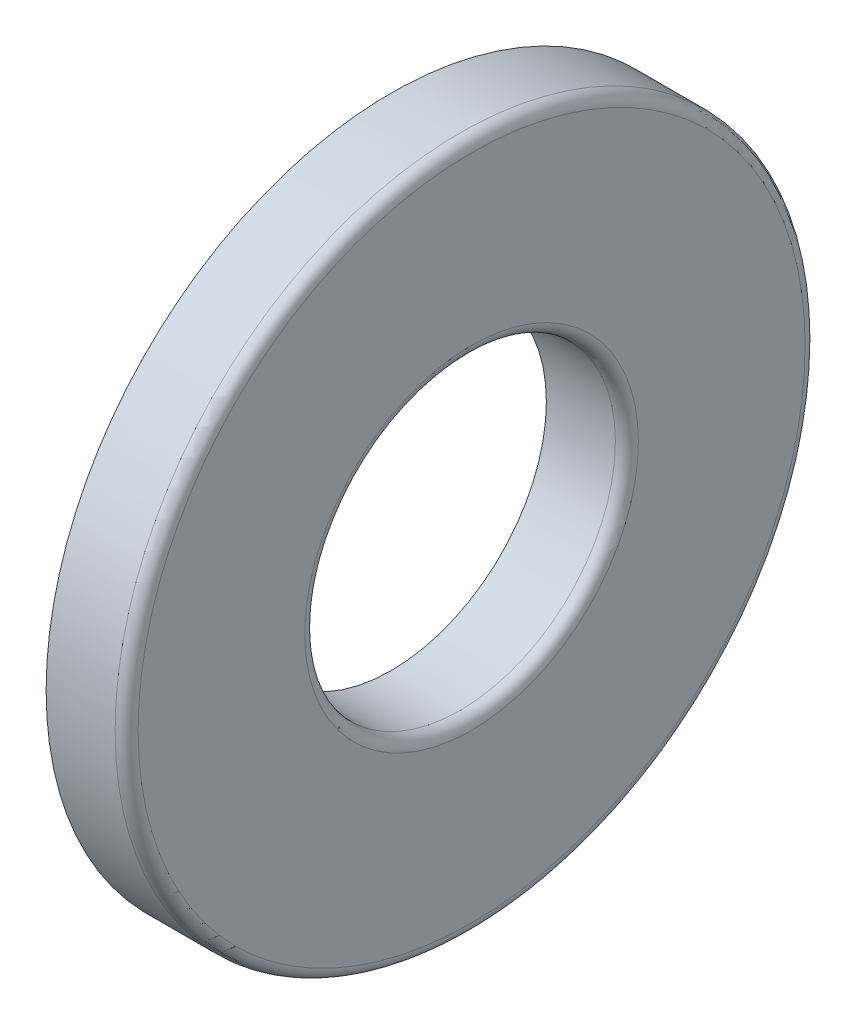
ISO-10303-21;
HEADER;
FILE_DESCRIPTION(('STEP AP214'),'2;1');
FILE_NAME('part.step','',(''),(''),'','','');
FILE_SCHEMA(('AUTOMOTIVE_DESIGN { 1 0 10303 214 1 1 1 1 }'));
ENDSEC;
DATA;
#1=APPLICATION_CONTEXT('core data for automotive mechanical design processes');
#2=APPLICATION_PROTOCOL_DEFINITION('international standard','automotive_design',2000,#1);
#3=PRODUCT_CONTEXT('',#1,'mechanical');
#4=PRODUCT('Part','Part','',(#3));
#5=PRODUCT_RELATED_PRODUCT_CATEGORY('part','',(#4));
#6=PRODUCT_DEFINITION_FORMATION('','',#4);
#7=PRODUCT_DEFINITION_CONTEXT('part definition',#1,'design');
#8=PRODUCT_DEFINITION('design','',#6,#7);
#9=PRODUCT_DEFINITION_SHAPE('','',#8);
#10=(LENGTH_UNIT() NAMED_UNIT(*) SI_UNIT(.MILLI.,.METRE.));
#11=(NAMED_UNIT(*) PLANE_ANGLE_UNIT() SI_UNIT($,.RADIAN.));
#12=(NAMED_UNIT(*) SI_UNIT($,.STERADIAN.) SOLID_ANGLE_UNIT());
#13=UNCERTAINTY_MEASURE_WITH_UNIT(LENGTH_MEASURE(1.E-05),#10,'distance_accuracy_value','');
#14=(GEOMETRIC_REPRESENTATION_CONTEXT(3) GLOBAL_UNCERTAINTY_ASSIGNED_CONTEXT((#13)) GLOBAL_UNIT_ASSIGNED_CONTEXT((#10,
#11,#12)) REPRESENTATION_CONTEXT('',''));
#15=CARTESIAN_POINT('',(0.,0.,0.));
#16=DIRECTION('',(0.,0.,1.));
#17=DIRECTION('',(1.,0.,0.));
#18=AXIS2_PLACEMENT_3D('',#15,#16,#17);
#19=CARTESIAN_POINT('',(12.,0.,0.));
#20=DIRECTION('',(1.,0.,0.));
#21=DIRECTION('',(0.,0.,-1.));
#22=AXIS2_PLACEMENT_3D('',#19,#20,#21);
#23=TOROIDAL_SURFACE('',#22,21.25,6.25);
#24=CARTESIAN_POINT('',(17.,0.,0.));
#25=DIRECTION('',(1.,0.,0.));
#26=DIRECTION('',(0.,0.,-1.));
#27=AXIS2_PLACEMENT_3D('',#24,#25,#26);
#28=CIRCLE('',#27,17.5);
#29=CARTESIAN_POINT('',(17.,0.,-17.5));
#30=VERTEX_POINT('',#29);
#31=EDGE_CURVE('E87',#30,#30,#28,.F.);
#32=ORIENTED_EDGE('',*,*,#31,.F.);
#33=EDGE_LOOP('',(#32));
#34=FACE_BOUND('',#33,.T.);
#35=CARTESIAN_POINT('',(17.,0.,0.));
#36=DIRECTION('',(1.,0.,0.));
#37=DIRECTION('',(0.,0.,-1.));
#38=AXIS2_PLACEMENT_3D('',#35,#36,#37);
#39=CIRCLE('',#38,25.);
#40=CARTESIAN_POINT('',(17.,0.,-25.));
#41=VERTEX_POINT('',#40);
#42=EDGE_CURVE('E18',#41,#41,#39,.T.);
#43=ORIENTED_EDGE('',*,*,#42,.F.);
#44=EDGE_LOOP('',(#43));
#45=FACE_BOUND('',#44,.T.);
#46=ADVANCED_FACE('F14',(#34,#45),#23,.F.);
#47=CARTESIAN_POINT('',(17.,30.,0.));
#48=DIRECTION('',(-1.,0.,0.));
#49=DIRECTION('',(0.,0.,1.));
#50=AXIS2_PLACEMENT_3D('',#47,#48,#49);
#51=PLANE('',#50);
#52=CARTESIAN_POINT('',(17.,0.,0.));
#53=DIRECTION('',(-1.,0.,0.));
#54=DIRECTION('',(0.,0.,1.));
#55=AXIS2_PLACEMENT_3D('',#52,#53,#54);
#56=CIRCLE('',#55,30.);
#57=CARTESIAN_POINT('',(17.,0.,30.));
#58=VERTEX_POINT('',#57);
#59=EDGE_CURVE('E85',#58,#58,#56,.F.);
#60=ORIENTED_EDGE('',*,*,#59,.F.);
#61=EDGE_LOOP('',(#60));
#62=FACE_BOUND('',#61,.T.);
#63=ORIENTED_EDGE('',*,*,#42,.T.);
#64=EDGE_LOOP('',(#63));
#65=FACE_BOUND('',#64,.T.);
#66=ADVANCED_FACE('F94',(#62,#65),#51,.T.);
#67=CARTESIAN_POINT('',(17.,17.5,0.));
#68=DIRECTION('',(-1.,0.,0.));
#69=DIRECTION('',(0.,0.,1.));
#70=AXIS2_PLACEMENT_3D('',#67,#68,#69);
#71=PLANE('',#70);
#72=ORIENTED_EDGE('',*,*,#31,.T.);
#73=EDGE_LOOP('',(#72));
#74=FACE_BOUND('',#73,.T.);
#75=CARTESIAN_POINT('',(17.,0.,0.));
#76=DIRECTION('',(-1.,0.,0.));
#77=DIRECTION('',(0.,0.,1.));
#78=AXIS2_PLACEMENT_3D('',#75,#76,#77);
#79=CIRCLE('',#78,13.5);
#80=CARTESIAN_POINT('',(17.,0.,13.5));
#81=VERTEX_POINT('',#80);
#82=EDGE_CURVE('E37',#81,#81,#79,.F.);
#83=ORIENTED_EDGE('',*,*,#82,.T.);
#84=EDGE_LOOP('',(#83));
#85=FACE_BOUND('',#84,.T.);
#86=ADVANCED_FACE('F102',(#74,#85),#71,.T.);
#87=CARTESIAN_POINT('',(23.,0.,0.));
#88=DIRECTION('',(-1.,0.,0.));
#89=DIRECTION('',(0.,0.,1.));
#90=AXIS2_PLACEMENT_3D('',#87,#88,#89);
#91=CYLINDRICAL_SURFACE('',#90,30.);
#92=CARTESIAN_POINT('',(23.,0.,0.));
#93=DIRECTION('',(1.,0.,0.));
#94=DIRECTION('',(0.,0.,-1.));
#95=AXIS2_PLACEMENT_3D('',#92,#93,#94);
#96=CIRCLE('',#95,30.);
#97=CARTESIAN_POINT('',(23.,0.,-30.));
#98=VERTEX_POINT('',#97);
#99=EDGE_CURVE('E32',#98,#98,#96,.T.);
#100=ORIENTED_EDGE('',*,*,#99,.F.);
#101=EDGE_LOOP('',(#100));
#102=FACE_BOUND('',#101,.T.);
#103=ORIENTED_EDGE('',*,*,#59,.T.);
#104=EDGE_LOOP('',(#103));
#105=FACE_BOUND('',#104,.T.);
#106=ADVANCED_FACE('F123',(#102,#105),#91,.T.);
#107=CARTESIAN_POINT('',(23.,0.,0.));
#108=DIRECTION('',(-1.,0.,0.));
#109=DIRECTION('',(0.,0.,1.));
#110=AXIS2_PLACEMENT_3D('',#107,#108,#109);
#111=CYLINDRICAL_SURFACE('',#110,13.5);
#112=ORIENTED_EDGE('',*,*,#82,.F.);
#113=EDGE_LOOP('',(#112));
#114=FACE_BOUND('',#113,.T.);
#115=CARTESIAN_POINT('',(23.,0.,0.));
#116=DIRECTION('',(1.,0.,0.));
#117=DIRECTION('',(0.,0.,-1.));
#118=AXIS2_PLACEMENT_3D('',#115,#116,#117);
#119=CIRCLE('',#118,13.5);
#120=CARTESIAN_POINT('',(23.,0.,-13.5));
#121=VERTEX_POINT('',#120);
#122=EDGE_CURVE('E27',#121,#121,#119,.F.);
#123=ORIENTED_EDGE('',*,*,#122,.F.);
#124=EDGE_LOOP('',(#123));
#125=FACE_BOUND('',#124,.T.);
#126=ADVANCED_FACE('F68',(#114,#125),#111,.F.);
#127=CARTESIAN_POINT('',(23.,0.,0.));
#128=DIRECTION('',(1.,0.,0.));
#129=DIRECTION('',(0.,0.,-1.));
#130=AXIS2_PLACEMENT_3D('',#127,#128,#129);
#131=TOROIDAL_SURFACE('',#130,29.,1.);
#132=CARTESIAN_POINT('',(24.,0.,0.));
#133=DIRECTION('',(-1.,0.,0.));
#134=DIRECTION('',(0.,0.,-1.));
#135=AXIS2_PLACEMENT_3D('',#132,#133,#134);
#136=CIRCLE('',#135,29.);
#137=CARTESIAN_POINT('',(24.,0.,-29.));
#138=VERTEX_POINT('',#137);
#139=EDGE_CURVE('E22',#138,#138,#136,.F.);
#140=ORIENTED_EDGE('',*,*,#139,.F.);
#141=EDGE_LOOP('',(#140));
#142=FACE_BOUND('',#141,.T.);
#143=ORIENTED_EDGE('',*,*,#99,.T.);
#144=EDGE_LOOP('',(#143));
#145=FACE_BOUND('',#144,.T.);
#146=ADVANCED_FACE('F63',(#142,#145),#131,.T.);
#147=CARTESIAN_POINT('',(23.,0.,0.));
#148=DIRECTION('',(1.,0.,0.));
#149=DIRECTION('',(0.,0.,-1.));
#150=AXIS2_PLACEMENT_3D('',#147,#148,#149);
#151=TOROIDAL_SURFACE('',#150,14.5,0.999999999999999);
#152=ORIENTED_EDGE('',*,*,#122,.T.);
#153=EDGE_LOOP('',(#152));
#154=FACE_BOUND('',#153,.T.);
#155=CARTESIAN_POINT('',(24.,0.,0.));
#156=DIRECTION('',(1.,0.,0.));
#157=DIRECTION('',(0.,0.,-1.));
#158=AXIS2_PLACEMENT_3D('',#155,#156,#157);
#159=CIRCLE('',#158,14.5);
#160=CARTESIAN_POINT('',(24.,0.,-14.5));
#161=VERTEX_POINT('',#160);
#162=EDGE_CURVE('E10',#161,#161,#159,.F.);
#163=ORIENTED_EDGE('',*,*,#162,.F.);
#164=EDGE_LOOP('',(#163));
#165=FACE_BOUND('',#164,.T.);
#166=ADVANCED_FACE('F52',(#154,#165),#151,.T.);
#167=CARTESIAN_POINT('',(24.,14.5,0.));
#168=DIRECTION('',(1.,0.,0.));
#169=DIRECTION('',(0.,0.,-1.));
#170=AXIS2_PLACEMENT_3D('',#167,#168,#169);
#171=PLANE('',#170);
#172=ORIENTED_EDGE('',*,*,#162,.T.);
#173=EDGE_LOOP('',(#172));
#174=FACE_BOUND('',#173,.T.);
#175=ORIENTED_EDGE('',*,*,#139,.T.);
#176=EDGE_LOOP('',(#175));
#177=FACE_BOUND('',#176,.T.);
#178=ADVANCED_FACE('F62',(#174,#177),#171,.T.);
#179=CLOSED_SHELL('',(#46,#66,#86,#106,#126,#146,#166,#178));
#180=MANIFOLD_SOLID_BREP('B1',#179);
#181=ADVANCED_BREP_SHAPE_REPRESENTATION('',(#18,#180),#14);
#182=SHAPE_DEFINITION_REPRESENTATION(#9,#181);
ENDSEC;
END-ISO-10303-21;
